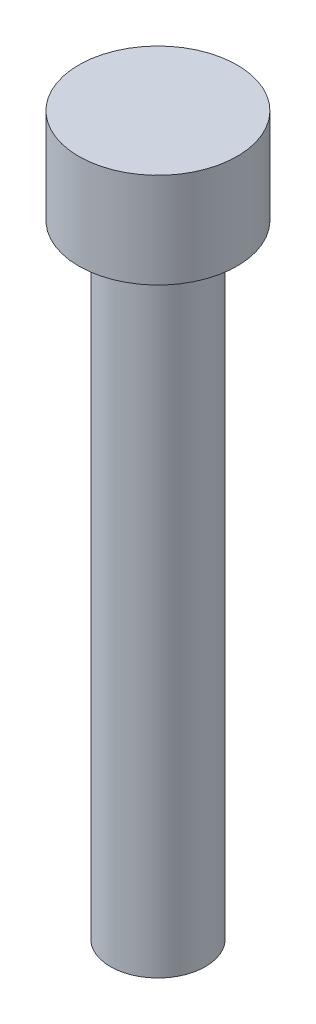
ISO-10303-21;
HEADER;
FILE_DESCRIPTION(('STEP AP214'),'2;1');
FILE_NAME('part.step','',(''),(''),'','','');
FILE_SCHEMA(('AUTOMOTIVE_DESIGN { 1 0 10303 214 1 1 1 1 }'));
ENDSEC;
DATA;
#1=APPLICATION_CONTEXT('core data for automotive mechanical design processes');
#2=APPLICATION_PROTOCOL_DEFINITION('international standard','automotive_design',2000,#1);
#3=PRODUCT_CONTEXT('',#1,'mechanical');
#4=PRODUCT('Part','Part','',(#3));
#5=PRODUCT_RELATED_PRODUCT_CATEGORY('part','',(#4));
#6=PRODUCT_DEFINITION_FORMATION('','',#4);
#7=PRODUCT_DEFINITION_CONTEXT('part definition',#1,'design');
#8=PRODUCT_DEFINITION('design','',#6,#7);
#9=PRODUCT_DEFINITION_SHAPE('','',#8);
#10=(LENGTH_UNIT() NAMED_UNIT(*) SI_UNIT(.MILLI.,.METRE.));
#11=(NAMED_UNIT(*) PLANE_ANGLE_UNIT() SI_UNIT($,.RADIAN.));
#12=(NAMED_UNIT(*) SI_UNIT($,.STERADIAN.) SOLID_ANGLE_UNIT());
#13=UNCERTAINTY_MEASURE_WITH_UNIT(LENGTH_MEASURE(1.E-05),#10,'distance_accuracy_value','');
#14=(GEOMETRIC_REPRESENTATION_CONTEXT(3) GLOBAL_UNCERTAINTY_ASSIGNED_CONTEXT((#13)) GLOBAL_UNIT_ASSIGNED_CONTEXT((#10,
#11,#12)) REPRESENTATION_CONTEXT('',''));
#15=CARTESIAN_POINT('',(0.,0.,0.));
#16=DIRECTION('',(0.,0.,1.));
#17=DIRECTION('',(1.,0.,0.));
#18=AXIS2_PLACEMENT_3D('',#15,#16,#17);
#19=CARTESIAN_POINT('',(0.,39.3,0.));
#20=DIRECTION('',(0.,-1.,0.));
#21=DIRECTION('',(0.,0.,-1.));
#22=AXIS2_PLACEMENT_3D('',#19,#20,#21);
#23=CYLINDRICAL_SURFACE('',#22,3.);
#24=CARTESIAN_POINT('',(0.,39.3,0.));
#25=DIRECTION('',(0.,1.,0.));
#26=DIRECTION('',(0.,0.,1.));
#27=AXIS2_PLACEMENT_3D('',#24,#25,#26);
#28=CIRCLE('',#27,3.);
#29=CARTESIAN_POINT('',(0.,39.3,3.));
#30=VERTEX_POINT('',#29);
#31=EDGE_CURVE('E10',#30,#30,#28,.T.);
#32=ORIENTED_EDGE('',*,*,#31,.F.);
#33=EDGE_LOOP('',(#32));
#34=FACE_BOUND('',#33,.T.);
#35=CARTESIAN_POINT('',(0.,0.,0.));
#36=DIRECTION('',(0.,1.,0.));
#37=DIRECTION('',(0.,0.,1.));
#38=AXIS2_PLACEMENT_3D('',#35,#36,#37);
#39=CIRCLE('',#38,3.);
#40=CARTESIAN_POINT('',(0.,0.,3.));
#41=VERTEX_POINT('',#40);
#42=EDGE_CURVE('E46',#41,#41,#39,.T.);
#43=ORIENTED_EDGE('',*,*,#42,.T.);
#44=EDGE_LOOP('',(#43));
#45=FACE_BOUND('',#44,.T.);
#46=ADVANCED_FACE('F43',(#34,#45),#23,.T.);
#47=CARTESIAN_POINT('',(0.,0.,0.));
#48=DIRECTION('',(0.,1.,0.));
#49=DIRECTION('',(0.,0.,1.));
#50=AXIS2_PLACEMENT_3D('',#47,#48,#49);
#51=PLANE('',#50);
#52=ORIENTED_EDGE('',*,*,#42,.F.);
#53=EDGE_LOOP('',(#52));
#54=FACE_BOUND('',#53,.T.);
#55=ADVANCED_FACE('F70',(#54),#51,.F.);
#56=CARTESIAN_POINT('',(0.,45.3,0.));
#57=DIRECTION('',(0.,-1.,0.));
#58=DIRECTION('',(0.,0.,-1.));
#59=AXIS2_PLACEMENT_3D('',#56,#57,#58);
#60=CYLINDRICAL_SURFACE('',#59,5.);
#61=CARTESIAN_POINT('',(0.,45.3,0.));
#62=DIRECTION('',(0.,1.,0.));
#63=DIRECTION('',(0.,0.,1.));
#64=AXIS2_PLACEMENT_3D('',#61,#62,#63);
#65=CIRCLE('',#64,5.);
#66=CARTESIAN_POINT('',(0.,45.3,5.));
#67=VERTEX_POINT('',#66);
#68=EDGE_CURVE('E55',#67,#67,#65,.T.);
#69=ORIENTED_EDGE('',*,*,#68,.F.);
#70=EDGE_LOOP('',(#69));
#71=FACE_BOUND('',#70,.T.);
#72=CARTESIAN_POINT('',(0.,39.3,0.));
#73=DIRECTION('',(0.,1.,0.));
#74=DIRECTION('',(0.,0.,1.));
#75=AXIS2_PLACEMENT_3D('',#72,#73,#74);
#76=CIRCLE('',#75,5.);
#77=CARTESIAN_POINT('',(0.,39.3,5.));
#78=VERTEX_POINT('',#77);
#79=EDGE_CURVE('E57',#78,#78,#76,.T.);
#80=ORIENTED_EDGE('',*,*,#79,.T.);
#81=EDGE_LOOP('',(#80));
#82=FACE_BOUND('',#81,.T.);
#83=ADVANCED_FACE('F67',(#71,#82),#60,.T.);
#84=CARTESIAN_POINT('',(0.,45.3,0.));
#85=DIRECTION('',(0.,1.,0.));
#86=DIRECTION('',(0.,0.,1.));
#87=AXIS2_PLACEMENT_3D('',#84,#85,#86);
#88=PLANE('',#87);
#89=ORIENTED_EDGE('',*,*,#68,.T.);
#90=EDGE_LOOP('',(#89));
#91=FACE_BOUND('',#90,.T.);
#92=ADVANCED_FACE('F65',(#91),#88,.T.);
#93=CARTESIAN_POINT('',(0.,39.3,0.));
#94=DIRECTION('',(0.,1.,0.));
#95=DIRECTION('',(0.,0.,1.));
#96=AXIS2_PLACEMENT_3D('',#93,#94,#95);
#97=PLANE('',#96);
#98=ORIENTED_EDGE('',*,*,#31,.T.);
#99=EDGE_LOOP('',(#98));
#100=FACE_BOUND('',#99,.T.);
#101=ORIENTED_EDGE('',*,*,#79,.F.);
#102=EDGE_LOOP('',(#101));
#103=FACE_BOUND('',#102,.T.);
#104=ADVANCED_FACE('F74',(#100,#103),#97,.F.);
#105=CLOSED_SHELL('',(#46,#55,#83,#92,#104));
#106=MANIFOLD_SOLID_BREP('B2',#105);
#107=ADVANCED_BREP_SHAPE_REPRESENTATION('',(#18,#106),#14);
#108=SHAPE_DEFINITION_REPRESENTATION(#9,#107);
ENDSEC;
END-ISO-10303-21;
